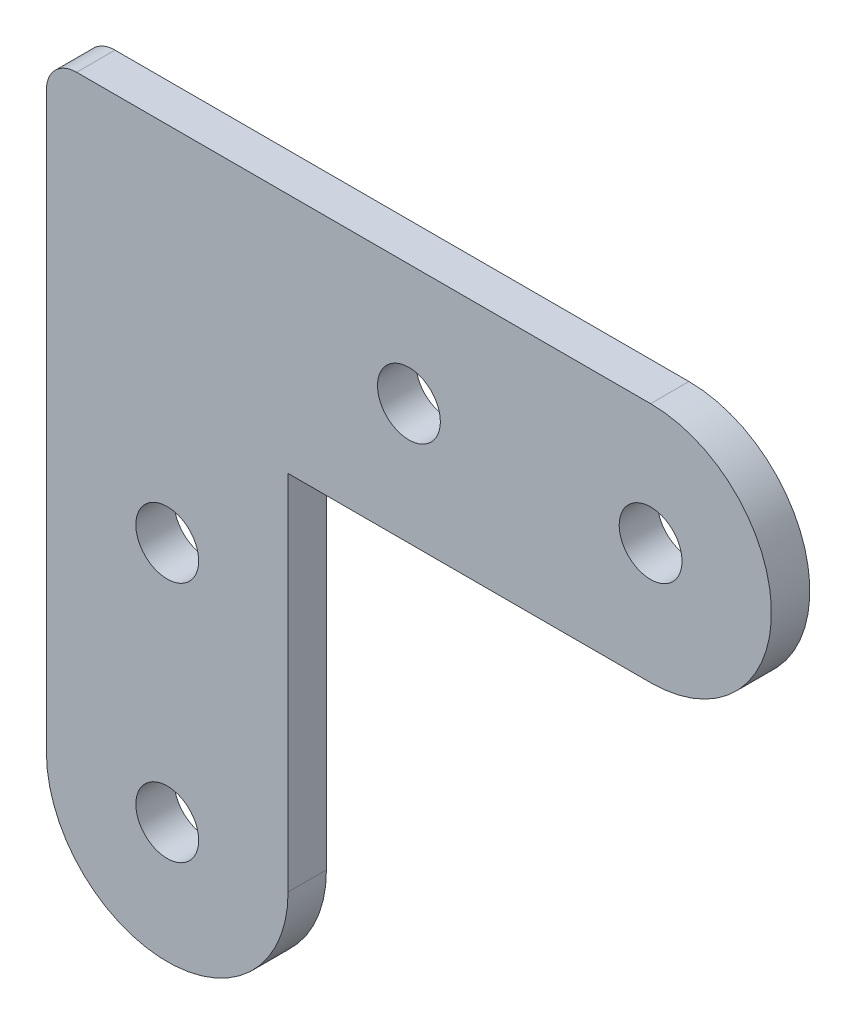
ISO-10303-21;
HEADER;
FILE_DESCRIPTION(('STEP AP214'),'2;1');
FILE_NAME('part.step','',(''),(''),'','','');
FILE_SCHEMA(('AUTOMOTIVE_DESIGN { 1 0 10303 214 1 1 1 1 }'));
ENDSEC;
DATA;
#1=APPLICATION_CONTEXT('core data for automotive mechanical design processes');
#2=APPLICATION_PROTOCOL_DEFINITION('international standard','automotive_design',2000,#1);
#3=PRODUCT_CONTEXT('',#1,'mechanical');
#4=PRODUCT('Part','Part','',(#3));
#5=PRODUCT_RELATED_PRODUCT_CATEGORY('part','',(#4));
#6=PRODUCT_DEFINITION_FORMATION('','',#4);
#7=PRODUCT_DEFINITION_CONTEXT('part definition',#1,'design');
#8=PRODUCT_DEFINITION('design','',#6,#7);
#9=PRODUCT_DEFINITION_SHAPE('','',#8);
#10=(LENGTH_UNIT() NAMED_UNIT(*) SI_UNIT(.MILLI.,.METRE.));
#11=(NAMED_UNIT(*) PLANE_ANGLE_UNIT() SI_UNIT($,.RADIAN.));
#12=(NAMED_UNIT(*) SI_UNIT($,.STERADIAN.) SOLID_ANGLE_UNIT());
#13=UNCERTAINTY_MEASURE_WITH_UNIT(LENGTH_MEASURE(1.E-05),#10,'distance_accuracy_value','');
#14=(GEOMETRIC_REPRESENTATION_CONTEXT(3) GLOBAL_UNCERTAINTY_ASSIGNED_CONTEXT((#13)) GLOBAL_UNIT_ASSIGNED_CONTEXT((#10,
#11,#12)) REPRESENTATION_CONTEXT('',''));
#15=CARTESIAN_POINT('',(0.,0.,0.));
#16=DIRECTION('',(0.,0.,1.));
#17=DIRECTION('',(1.,0.,0.));
#18=AXIS2_PLACEMENT_3D('',#15,#16,#17);
#19=CARTESIAN_POINT('',(-395.316058397291,325.30973672867,-164.096453779356));
#20=DIRECTION('',(0.,0.,-1.));
#21=DIRECTION('',(-1.,0.,0.));
#22=AXIS2_PLACEMENT_3D('',#19,#20,#21);
#23=CYLINDRICAL_SURFACE('',#22,9.99999999999998);
#24=CARTESIAN_POINT('',(-395.316058397291,325.30973672867,-167.271453779356));
#25=DIRECTION('',(0.,0.,-1.));
#26=DIRECTION('',(-1.,0.,0.));
#27=AXIS2_PLACEMENT_3D('',#24,#25,#26);
#28=CIRCLE('',#27,9.99999999999998);
#29=CARTESIAN_POINT('',(-395.316058397291,335.30973672867,-167.271453779356));
#30=VERTEX_POINT('',#29);
#31=CARTESIAN_POINT('',(-395.316058397291,315.30973672867,-167.271453779356));
#32=VERTEX_POINT('',#31);
#33=EDGE_CURVE('E127',#30,#32,#28,.T.);
#34=ORIENTED_EDGE('',*,*,#33,.F.);
#35=DIRECTION('',(0.,0.,-1.));
#36=VECTOR('',#35,1.);
#37=CARTESIAN_POINT('',(-395.316058397291,335.30973672867,-164.096453779356));
#38=LINE('',#37,#36);
#39=CARTESIAN_POINT('',(-395.316058397291,335.30973672867,-164.096453779356));
#40=VERTEX_POINT('',#39);
#41=EDGE_CURVE('E11',#40,#30,#38,.T.);
#42=ORIENTED_EDGE('',*,*,#41,.F.);
#43=CARTESIAN_POINT('',(-395.316058397291,325.30973672867,-164.096453779356));
#44=DIRECTION('',(0.,0.,-1.));
#45=DIRECTION('',(-1.,0.,0.));
#46=AXIS2_PLACEMENT_3D('',#43,#44,#45);
#47=CIRCLE('',#46,9.99999999999998);
#48=CARTESIAN_POINT('',(-395.316058397291,315.30973672867,-164.096453779356));
#49=VERTEX_POINT('',#48);
#50=EDGE_CURVE('E145',#40,#49,#47,.T.);
#51=ORIENTED_EDGE('',*,*,#50,.T.);
#52=DIRECTION('',(0.,0.,-1.));
#53=VECTOR('',#52,1.);
#54=CARTESIAN_POINT('',(-395.316058397291,315.30973672867,-164.096453779356));
#55=LINE('',#54,#53);
#56=EDGE_CURVE('E39',#49,#32,#55,.T.);
#57=ORIENTED_EDGE('',*,*,#56,.T.);
#58=EDGE_LOOP('',(#34,#42,#51,#57));
#59=FACE_BOUND('',#58,.T.);
#60=ADVANCED_FACE('F36',(#59),#23,.T.);
#61=CARTESIAN_POINT('',(-442.816058397291,335.30973672867,-164.096453779356));
#62=DIRECTION('',(0.,1.,0.));
#63=DIRECTION('',(0.,0.,1.));
#64=AXIS2_PLACEMENT_3D('',#61,#62,#63);
#65=PLANE('',#64);
#66=DIRECTION('',(1.,0.,0.));
#67=VECTOR('',#66,1.);
#68=CARTESIAN_POINT('',(-442.816058397291,335.30973672867,-167.271453779356));
#69=LINE('',#68,#67);
#70=CARTESIAN_POINT('',(-442.816058397291,335.30973672867,-167.271453779356));
#71=VERTEX_POINT('',#70);
#72=EDGE_CURVE('E143',#71,#30,#69,.T.);
#73=ORIENTED_EDGE('',*,*,#72,.F.);
#74=DIRECTION('',(0.,0.,-1.));
#75=VECTOR('',#74,1.);
#76=CARTESIAN_POINT('',(-442.816058397291,335.30973672867,-164.096453779356));
#77=LINE('',#76,#75);
#78=CARTESIAN_POINT('',(-442.816058397291,335.30973672867,-164.096453779356));
#79=VERTEX_POINT('',#78);
#80=EDGE_CURVE('E45',#79,#71,#77,.T.);
#81=ORIENTED_EDGE('',*,*,#80,.F.);
#82=DIRECTION('',(1.,0.,0.));
#83=VECTOR('',#82,1.);
#84=CARTESIAN_POINT('',(-442.816058397291,335.30973672867,-164.096453779356));
#85=LINE('',#84,#83);
#86=EDGE_CURVE('E117',#79,#40,#85,.T.);
#87=ORIENTED_EDGE('',*,*,#86,.T.);
#88=ORIENTED_EDGE('',*,*,#41,.T.);
#89=EDGE_LOOP('',(#73,#81,#87,#88));
#90=FACE_BOUND('',#89,.T.);
#91=ADVANCED_FACE('F155',(#90),#65,.T.);
#92=CARTESIAN_POINT('',(-442.816058397291,332.80973672867,-164.096453779356));
#93=DIRECTION('',(0.,0.,-1.));
#94=DIRECTION('',(-1.,0.,0.));
#95=AXIS2_PLACEMENT_3D('',#92,#93,#94);
#96=CYLINDRICAL_SURFACE('',#95,2.5);
#97=CARTESIAN_POINT('',(-442.816058397291,332.80973672867,-167.271453779356));
#98=DIRECTION('',(0.,0.,-1.));
#99=DIRECTION('',(-1.,0.,0.));
#100=AXIS2_PLACEMENT_3D('',#97,#98,#99);
#101=CIRCLE('',#100,2.5);
#102=CARTESIAN_POINT('',(-445.316058397291,332.80973672867,-167.271453779356));
#103=VERTEX_POINT('',#102);
#104=EDGE_CURVE('E104',#103,#71,#101,.T.);
#105=ORIENTED_EDGE('',*,*,#104,.F.);
#106=DIRECTION('',(0.,0.,-1.));
#107=VECTOR('',#106,1.);
#108=CARTESIAN_POINT('',(-445.316058397291,332.80973672867,-164.096453779356));
#109=LINE('',#108,#107);
#110=CARTESIAN_POINT('',(-445.316058397291,332.80973672867,-164.096453779356));
#111=VERTEX_POINT('',#110);
#112=EDGE_CURVE('E99',#111,#103,#109,.T.);
#113=ORIENTED_EDGE('',*,*,#112,.F.);
#114=CARTESIAN_POINT('',(-442.816058397291,332.80973672867,-164.096453779356));
#115=DIRECTION('',(0.,0.,-1.));
#116=DIRECTION('',(-1.,0.,0.));
#117=AXIS2_PLACEMENT_3D('',#114,#115,#116);
#118=CIRCLE('',#117,2.5);
#119=EDGE_CURVE('E102',#111,#79,#118,.T.);
#120=ORIENTED_EDGE('',*,*,#119,.T.);
#121=ORIENTED_EDGE('',*,*,#80,.T.);
#122=EDGE_LOOP('',(#105,#113,#120,#121));
#123=FACE_BOUND('',#122,.T.);
#124=ADVANCED_FACE('F101',(#123),#96,.T.);
#125=CARTESIAN_POINT('',(-445.316058397291,285.30973672867,-164.096453779356));
#126=DIRECTION('',(-1.,0.,0.));
#127=DIRECTION('',(0.,0.,1.));
#128=AXIS2_PLACEMENT_3D('',#125,#126,#127);
#129=PLANE('',#128);
#130=DIRECTION('',(0.,1.,0.));
#131=VECTOR('',#130,1.);
#132=CARTESIAN_POINT('',(-445.316058397291,285.30973672867,-167.271453779356));
#133=LINE('',#132,#131);
#134=CARTESIAN_POINT('',(-445.316058397291,285.30973672867,-167.271453779356));
#135=VERTEX_POINT('',#134);
#136=EDGE_CURVE('E140',#135,#103,#133,.T.);
#137=ORIENTED_EDGE('',*,*,#136,.F.);
#138=DIRECTION('',(0.,0.,-1.));
#139=VECTOR('',#138,1.);
#140=CARTESIAN_POINT('',(-445.316058397291,285.30973672867,-164.096453779356));
#141=LINE('',#140,#139);
#142=CARTESIAN_POINT('',(-445.316058397291,285.30973672867,-164.096453779356));
#143=VERTEX_POINT('',#142);
#144=EDGE_CURVE('E109',#143,#135,#141,.T.);
#145=ORIENTED_EDGE('',*,*,#144,.F.);
#146=DIRECTION('',(0.,1.,0.));
#147=VECTOR('',#146,1.);
#148=CARTESIAN_POINT('',(-445.316058397291,285.30973672867,-164.096453779356));
#149=LINE('',#148,#147);
#150=EDGE_CURVE('E115',#143,#111,#149,.T.);
#151=ORIENTED_EDGE('',*,*,#150,.T.);
#152=ORIENTED_EDGE('',*,*,#112,.T.);
#153=EDGE_LOOP('',(#137,#145,#151,#152));
#154=FACE_BOUND('',#153,.T.);
#155=ADVANCED_FACE('F119',(#154),#129,.T.);
#156=CARTESIAN_POINT('',(-435.316058397291,285.30973672867,-164.096453779356));
#157=DIRECTION('',(0.,0.,-1.));
#158=DIRECTION('',(-1.,0.,0.));
#159=AXIS2_PLACEMENT_3D('',#156,#157,#158);
#160=CYLINDRICAL_SURFACE('',#159,10.);
#161=CARTESIAN_POINT('',(-435.316058397291,285.30973672867,-167.271453779356));
#162=DIRECTION('',(0.,0.,-1.));
#163=DIRECTION('',(-1.,0.,0.));
#164=AXIS2_PLACEMENT_3D('',#161,#162,#163);
#165=CIRCLE('',#164,10.);
#166=CARTESIAN_POINT('',(-425.316058397291,285.30973672867,-167.271453779356));
#167=VERTEX_POINT('',#166);
#168=EDGE_CURVE('E137',#167,#135,#165,.T.);
#169=ORIENTED_EDGE('',*,*,#168,.F.);
#170=DIRECTION('',(0.,0.,-1.));
#171=VECTOR('',#170,1.);
#172=CARTESIAN_POINT('',(-425.316058397291,285.30973672867,-164.096453779356));
#173=LINE('',#172,#171);
#174=CARTESIAN_POINT('',(-425.316058397291,285.30973672867,-164.096453779356));
#175=VERTEX_POINT('',#174);
#176=EDGE_CURVE('E149',#175,#167,#173,.T.);
#177=ORIENTED_EDGE('',*,*,#176,.F.);
#178=CARTESIAN_POINT('',(-435.316058397291,285.30973672867,-164.096453779356));
#179=DIRECTION('',(0.,0.,-1.));
#180=DIRECTION('',(-1.,0.,0.));
#181=AXIS2_PLACEMENT_3D('',#178,#179,#180);
#182=CIRCLE('',#181,10.);
#183=EDGE_CURVE('E120',#175,#143,#182,.T.);
#184=ORIENTED_EDGE('',*,*,#183,.T.);
#185=ORIENTED_EDGE('',*,*,#144,.T.);
#186=EDGE_LOOP('',(#169,#177,#184,#185));
#187=FACE_BOUND('',#186,.T.);
#188=ADVANCED_FACE('F168',(#187),#160,.T.);
#189=CARTESIAN_POINT('',(-425.316058397291,315.30973672867,-164.096453779356));
#190=DIRECTION('',(1.,0.,0.));
#191=DIRECTION('',(0.,0.,-1.));
#192=AXIS2_PLACEMENT_3D('',#189,#190,#191);
#193=PLANE('',#192);
#194=DIRECTION('',(0.,-1.,0.));
#195=VECTOR('',#194,1.);
#196=CARTESIAN_POINT('',(-425.316058397291,315.30973672867,-167.271453779356));
#197=LINE('',#196,#195);
#198=CARTESIAN_POINT('',(-425.316058397291,315.30973672867,-167.271453779356));
#199=VERTEX_POINT('',#198);
#200=EDGE_CURVE('E134',#199,#167,#197,.T.);
#201=ORIENTED_EDGE('',*,*,#200,.F.);
#202=DIRECTION('',(0.,0.,-1.));
#203=VECTOR('',#202,1.);
#204=CARTESIAN_POINT('',(-425.316058397291,315.30973672867,-164.096453779356));
#205=LINE('',#204,#203);
#206=CARTESIAN_POINT('',(-425.316058397291,315.30973672867,-164.096453779356));
#207=VERTEX_POINT('',#206);
#208=EDGE_CURVE('E150',#207,#199,#205,.T.);
#209=ORIENTED_EDGE('',*,*,#208,.F.);
#210=DIRECTION('',(0.,-1.,0.));
#211=VECTOR('',#210,1.);
#212=CARTESIAN_POINT('',(-425.316058397291,315.30973672867,-164.096453779356));
#213=LINE('',#212,#211);
#214=EDGE_CURVE('E122',#207,#175,#213,.T.);
#215=ORIENTED_EDGE('',*,*,#214,.T.);
#216=ORIENTED_EDGE('',*,*,#176,.T.);
#217=EDGE_LOOP('',(#201,#209,#215,#216));
#218=FACE_BOUND('',#217,.T.);
#219=ADVANCED_FACE('F171',(#218),#193,.T.);
#220=CARTESIAN_POINT('',(-395.316058397291,315.30973672867,-164.096453779356));
#221=DIRECTION('',(0.,-1.,0.));
#222=DIRECTION('',(0.,0.,-1.));
#223=AXIS2_PLACEMENT_3D('',#220,#221,#222);
#224=PLANE('',#223);
#225=DIRECTION('',(-1.,0.,0.));
#226=VECTOR('',#225,1.);
#227=CARTESIAN_POINT('',(-395.316058397291,315.30973672867,-167.271453779356));
#228=LINE('',#227,#226);
#229=EDGE_CURVE('E130',#32,#199,#228,.T.);
#230=ORIENTED_EDGE('',*,*,#229,.F.);
#231=ORIENTED_EDGE('',*,*,#56,.F.);
#232=DIRECTION('',(-1.,0.,0.));
#233=VECTOR('',#232,1.);
#234=CARTESIAN_POINT('',(-395.316058397291,315.30973672867,-164.096453779356));
#235=LINE('',#234,#233);
#236=EDGE_CURVE('E231',#49,#207,#235,.T.);
#237=ORIENTED_EDGE('',*,*,#236,.T.);
#238=ORIENTED_EDGE('',*,*,#208,.T.);
#239=EDGE_LOOP('',(#230,#231,#237,#238));
#240=FACE_BOUND('',#239,.T.);
#241=ADVANCED_FACE('F152',(#240),#224,.T.);
#242=CARTESIAN_POINT('',(-395.316058397291,325.30973672867,-164.096453779356));
#243=DIRECTION('',(0.,0.,-1.));
#244=DIRECTION('',(-1.,0.,0.));
#245=AXIS2_PLACEMENT_3D('',#242,#243,#244);
#246=PLANE('',#245);
#247=CARTESIAN_POINT('',(-435.316058397291,285.30973672867,-164.096453779356));
#248=DIRECTION('',(0.,0.,-1.));
#249=DIRECTION('',(0.,1.,0.));
#250=AXIS2_PLACEMENT_3D('',#247,#248,#249);
#251=CIRCLE('',#250,2.59999999999999);
#252=CARTESIAN_POINT('',(-435.316058397291,287.90973672867,-164.096453779356));
#253=VERTEX_POINT('',#252);
#254=EDGE_CURVE('E206',#253,#253,#251,.T.);
#255=ORIENTED_EDGE('',*,*,#254,.T.);
#256=EDGE_LOOP('',(#255));
#257=FACE_BOUND('',#256,.T.);
#258=CARTESIAN_POINT('',(-395.316058397291,325.30973672867,-164.096453779355));
#259=DIRECTION('',(0.,0.,-1.));
#260=DIRECTION('',(0.,1.,0.));
#261=AXIS2_PLACEMENT_3D('',#258,#259,#260);
#262=CIRCLE('',#261,2.59999999999999);
#263=CARTESIAN_POINT('',(-395.316058397291,327.90973672867,-164.096453779355));
#264=VERTEX_POINT('',#263);
#265=EDGE_CURVE('E216',#264,#264,#262,.T.);
#266=ORIENTED_EDGE('',*,*,#265,.T.);
#267=EDGE_LOOP('',(#266));
#268=FACE_BOUND('',#267,.T.);
#269=CARTESIAN_POINT('',(-415.316058397291,325.30973672867,-164.096453779355));
#270=DIRECTION('',(0.,0.,-1.));
#271=DIRECTION('',(0.,1.,0.));
#272=AXIS2_PLACEMENT_3D('',#269,#270,#271);
#273=CIRCLE('',#272,2.59999999999999);
#274=CARTESIAN_POINT('',(-415.316058397291,327.90973672867,-164.096453779355));
#275=VERTEX_POINT('',#274);
#276=EDGE_CURVE('E222',#275,#275,#273,.T.);
#277=ORIENTED_EDGE('',*,*,#276,.T.);
#278=EDGE_LOOP('',(#277));
#279=FACE_BOUND('',#278,.T.);
#280=CARTESIAN_POINT('',(-435.316058397291,305.336856842041,-164.096453779356));
#281=DIRECTION('',(0.,0.,-1.));
#282=DIRECTION('',(0.,1.,0.));
#283=AXIS2_PLACEMENT_3D('',#280,#281,#282);
#284=CIRCLE('',#283,2.59999999999999);
#285=CARTESIAN_POINT('',(-435.316058397291,307.936856842041,-164.096453779356));
#286=VERTEX_POINT('',#285);
#287=EDGE_CURVE('E131',#286,#286,#284,.T.);
#288=ORIENTED_EDGE('',*,*,#287,.T.);
#289=EDGE_LOOP('',(#288));
#290=FACE_BOUND('',#289,.T.);
#291=ORIENTED_EDGE('',*,*,#50,.F.);
#292=ORIENTED_EDGE('',*,*,#86,.F.);
#293=ORIENTED_EDGE('',*,*,#119,.F.);
#294=ORIENTED_EDGE('',*,*,#150,.F.);
#295=ORIENTED_EDGE('',*,*,#183,.F.);
#296=ORIENTED_EDGE('',*,*,#214,.F.);
#297=ORIENTED_EDGE('',*,*,#236,.F.);
#298=EDGE_LOOP('',(#291,#292,#293,#294,#295,#296,#297));
#299=FACE_BOUND('',#298,.T.);
#300=ADVANCED_FACE('F113',(#257,#268,#279,#290,#299),#246,.F.);
#301=CARTESIAN_POINT('',(-395.316058397291,325.30973672867,-167.271453779356));
#302=DIRECTION('',(0.,0.,-1.));
#303=DIRECTION('',(-1.,0.,0.));
#304=AXIS2_PLACEMENT_3D('',#301,#302,#303);
#305=PLANE('',#304);
#306=CARTESIAN_POINT('',(-435.316058397291,285.30973672867,-167.271453779356));
#307=DIRECTION('',(0.,0.,-1.));
#308=DIRECTION('',(0.,1.,0.));
#309=AXIS2_PLACEMENT_3D('',#306,#307,#308);
#310=CIRCLE('',#309,2.59999999999999);
#311=CARTESIAN_POINT('',(-435.316058397291,287.90973672867,-167.271453779356));
#312=VERTEX_POINT('',#311);
#313=EDGE_CURVE('E209',#312,#312,#310,.T.);
#314=ORIENTED_EDGE('',*,*,#313,.F.);
#315=EDGE_LOOP('',(#314));
#316=FACE_BOUND('',#315,.T.);
#317=CARTESIAN_POINT('',(-395.316058397291,325.30973672867,-167.271453779356));
#318=DIRECTION('',(0.,0.,-1.));
#319=DIRECTION('',(0.,1.,0.));
#320=AXIS2_PLACEMENT_3D('',#317,#318,#319);
#321=CIRCLE('',#320,2.59999999999999);
#322=CARTESIAN_POINT('',(-395.316058397291,327.90973672867,-167.271453779356));
#323=VERTEX_POINT('',#322);
#324=EDGE_CURVE('E211',#323,#323,#321,.T.);
#325=ORIENTED_EDGE('',*,*,#324,.F.);
#326=EDGE_LOOP('',(#325));
#327=FACE_BOUND('',#326,.T.);
#328=CARTESIAN_POINT('',(-415.316058397291,325.30973672867,-167.271453779356));
#329=DIRECTION('',(0.,0.,-1.));
#330=DIRECTION('',(0.,1.,0.));
#331=AXIS2_PLACEMENT_3D('',#328,#329,#330);
#332=CIRCLE('',#331,2.59999999999999);
#333=CARTESIAN_POINT('',(-415.316058397291,327.90973672867,-167.271453779356));
#334=VERTEX_POINT('',#333);
#335=EDGE_CURVE('E219',#334,#334,#332,.T.);
#336=ORIENTED_EDGE('',*,*,#335,.F.);
#337=EDGE_LOOP('',(#336));
#338=FACE_BOUND('',#337,.T.);
#339=CARTESIAN_POINT('',(-435.316058397291,305.336856842041,-167.271453779356));
#340=DIRECTION('',(0.,0.,-1.));
#341=DIRECTION('',(0.,1.,0.));
#342=AXIS2_PLACEMENT_3D('',#339,#340,#341);
#343=CIRCLE('',#342,2.59999999999999);
#344=CARTESIAN_POINT('',(-435.316058397291,307.936856842041,-167.271453779356));
#345=VERTEX_POINT('',#344);
#346=EDGE_CURVE('E225',#345,#345,#343,.T.);
#347=ORIENTED_EDGE('',*,*,#346,.F.);
#348=EDGE_LOOP('',(#347));
#349=FACE_BOUND('',#348,.T.);
#350=ORIENTED_EDGE('',*,*,#33,.T.);
#351=ORIENTED_EDGE('',*,*,#229,.T.);
#352=ORIENTED_EDGE('',*,*,#200,.T.);
#353=ORIENTED_EDGE('',*,*,#168,.T.);
#354=ORIENTED_EDGE('',*,*,#136,.T.);
#355=ORIENTED_EDGE('',*,*,#104,.T.);
#356=ORIENTED_EDGE('',*,*,#72,.T.);
#357=EDGE_LOOP('',(#350,#351,#352,#353,#354,#355,#356));
#358=FACE_BOUND('',#357,.T.);
#359=ADVANCED_FACE('F154',(#316,#327,#338,#349,#358),#305,.T.);
#360=CARTESIAN_POINT('',(-435.316058397291,305.336856842041,-167.271453779356));
#361=DIRECTION('',(0.,0.,-1.));
#362=DIRECTION('',(0.,1.,0.));
#363=AXIS2_PLACEMENT_3D('',#360,#361,#362);
#364=CYLINDRICAL_SURFACE('',#363,2.59999999999999);
#365=ORIENTED_EDGE('',*,*,#287,.F.);
#366=EDGE_LOOP('',(#365));
#367=FACE_BOUND('',#366,.T.);
#368=ORIENTED_EDGE('',*,*,#346,.T.);
#369=EDGE_LOOP('',(#368));
#370=FACE_BOUND('',#369,.T.);
#371=ADVANCED_FACE('F183',(#367,#370),#364,.F.);
#372=CARTESIAN_POINT('',(-415.316058397291,325.30973672867,-167.271453779356));
#373=DIRECTION('',(0.,0.,-1.));
#374=DIRECTION('',(0.,1.,0.));
#375=AXIS2_PLACEMENT_3D('',#372,#373,#374);
#376=CYLINDRICAL_SURFACE('',#375,2.59999999999999);
#377=ORIENTED_EDGE('',*,*,#276,.F.);
#378=EDGE_LOOP('',(#377));
#379=FACE_BOUND('',#378,.T.);
#380=ORIENTED_EDGE('',*,*,#335,.T.);
#381=EDGE_LOOP('',(#380));
#382=FACE_BOUND('',#381,.T.);
#383=ADVANCED_FACE('F190',(#379,#382),#376,.F.);
#384=CARTESIAN_POINT('',(-395.316058397291,325.30973672867,-167.271453779356));
#385=DIRECTION('',(0.,0.,-1.));
#386=DIRECTION('',(0.,1.,0.));
#387=AXIS2_PLACEMENT_3D('',#384,#385,#386);
#388=CYLINDRICAL_SURFACE('',#387,2.59999999999999);
#389=ORIENTED_EDGE('',*,*,#265,.F.);
#390=EDGE_LOOP('',(#389));
#391=FACE_BOUND('',#390,.T.);
#392=ORIENTED_EDGE('',*,*,#324,.T.);
#393=EDGE_LOOP('',(#392));
#394=FACE_BOUND('',#393,.T.);
#395=ADVANCED_FACE('F194',(#391,#394),#388,.F.);
#396=CARTESIAN_POINT('',(-435.316058397291,285.30973672867,-167.271453779356));
#397=DIRECTION('',(0.,0.,-1.));
#398=DIRECTION('',(0.,1.,0.));
#399=AXIS2_PLACEMENT_3D('',#396,#397,#398);
#400=CYLINDRICAL_SURFACE('',#399,2.59999999999999);
#401=ORIENTED_EDGE('',*,*,#254,.F.);
#402=EDGE_LOOP('',(#401));
#403=FACE_BOUND('',#402,.T.);
#404=ORIENTED_EDGE('',*,*,#313,.T.);
#405=EDGE_LOOP('',(#404));
#406=FACE_BOUND('',#405,.T.);
#407=ADVANCED_FACE('F198',(#403,#406),#400,.F.);
#408=CLOSED_SHELL('',(#60,#91,#124,#155,#188,#219,#241,#300,#359,#371,#383,#395,#407));
#409=MANIFOLD_SOLID_BREP('B2',#408);
#410=ADVANCED_BREP_SHAPE_REPRESENTATION('',(#18,#409),#14);
#411=SHAPE_DEFINITION_REPRESENTATION(#9,#410);
ENDSEC;
END-ISO-10303-21;
